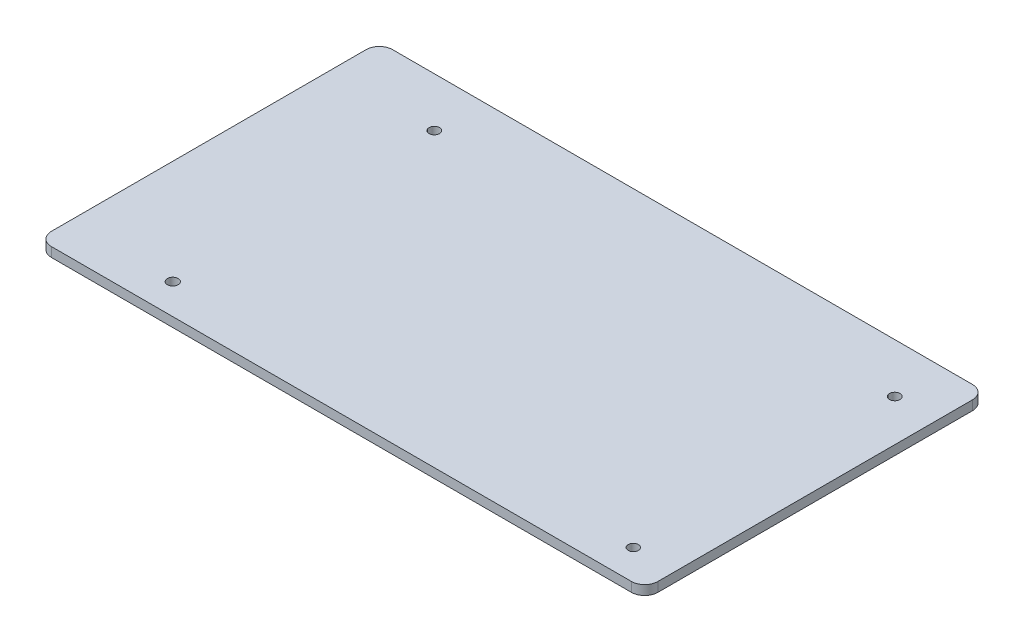
ISO-10303-21;
HEADER;
FILE_DESCRIPTION(('STEP AP214'),'2;1');
FILE_NAME('part.step','',(''),(''),'','','');
FILE_SCHEMA(('AUTOMOTIVE_DESIGN { 1 0 10303 214 1 1 1 1 }'));
ENDSEC;
DATA;
#1=APPLICATION_CONTEXT('core data for automotive mechanical design processes');
#2=APPLICATION_PROTOCOL_DEFINITION('international standard','automotive_design',2000,#1);
#3=PRODUCT_CONTEXT('',#1,'mechanical');
#4=PRODUCT('Part','Part','',(#3));
#5=PRODUCT_RELATED_PRODUCT_CATEGORY('part','',(#4));
#6=PRODUCT_DEFINITION_FORMATION('','',#4);
#7=PRODUCT_DEFINITION_CONTEXT('part definition',#1,'design');
#8=PRODUCT_DEFINITION('design','',#6,#7);
#9=PRODUCT_DEFINITION_SHAPE('','',#8);
#10=(LENGTH_UNIT() NAMED_UNIT(*) SI_UNIT(.MILLI.,.METRE.));
#11=(NAMED_UNIT(*) PLANE_ANGLE_UNIT() SI_UNIT($,.RADIAN.));
#12=(NAMED_UNIT(*) SI_UNIT($,.STERADIAN.) SOLID_ANGLE_UNIT());
#13=UNCERTAINTY_MEASURE_WITH_UNIT(LENGTH_MEASURE(1.E-05),#10,'distance_accuracy_value','');
#14=(GEOMETRIC_REPRESENTATION_CONTEXT(3) GLOBAL_UNCERTAINTY_ASSIGNED_CONTEXT((#13)) GLOBAL_UNIT_ASSIGNED_CONTEXT((#10,
#11,#12)) REPRESENTATION_CONTEXT('',''));
#15=CARTESIAN_POINT('',(0.,0.,0.));
#16=DIRECTION('',(0.,0.,1.));
#17=DIRECTION('',(1.,0.,0.));
#18=AXIS2_PLACEMENT_3D('',#15,#16,#17);
#19=CARTESIAN_POINT('',(-0.000677997091998267,2.5,45.0011504842423));
#20=DIRECTION('',(1.50662168550274E-05,0.,-0.999999999886505));
#21=DIRECTION('',(-0.999999999886505,0.,-1.50662168550274E-05));
#22=AXIS2_PLACEMENT_3D('',#19,#20,#21);
#23=PLANE('',#22);
#24=DIRECTION('',(0.999999999886505,0.,1.50662168550274E-05));
#25=VECTOR('',#24,1.);
#26=CARTESIAN_POINT('',(-0.000677997091998267,0.,45.0011504842423));
#27=LINE('',#26,#25);
#28=CARTESIAN_POINT('',(-76.4988487225898,0.,44.9999989731105));
#29=VERTEX_POINT('',#28);
#30=CARTESIAN_POINT('',(76.5031206921741,0.,45.0023031070637));
#31=VERTEX_POINT('',#30);
#32=EDGE_CURVE('E165',#29,#31,#27,.T.);
#33=ORIENTED_EDGE('',*,*,#32,.T.);
#34=DIRECTION('',(0.,-1.,0.));
#35=VECTOR('',#34,1.);
#36=CARTESIAN_POINT('',(76.5031206921741,2.5,45.0023031070637));
#37=LINE('',#36,#35);
#38=CARTESIAN_POINT('',(76.5031206921741,2.5,45.0023031070637));
#39=VERTEX_POINT('',#38);
#40=EDGE_CURVE('E207',#39,#31,#37,.T.);
#41=ORIENTED_EDGE('',*,*,#40,.F.);
#42=DIRECTION('',(0.999999999886505,0.,1.50662168550274E-05));
#43=VECTOR('',#42,1.);
#44=CARTESIAN_POINT('',(-0.000677997091998267,2.5,45.0011504842423));
#45=LINE('',#44,#43);
#46=CARTESIAN_POINT('',(-76.4988487225898,2.5,44.9999989731105));
#47=VERTEX_POINT('',#46);
#48=EDGE_CURVE('E188',#47,#39,#45,.T.);
#49=ORIENTED_EDGE('',*,*,#48,.F.);
#50=DIRECTION('',(0.,-1.,0.));
#51=VECTOR('',#50,1.);
#52=CARTESIAN_POINT('',(-76.4988487225898,2.5,44.9999989731105));
#53=LINE('',#52,#51);
#54=EDGE_CURVE('E164',#47,#29,#53,.T.);
#55=ORIENTED_EDGE('',*,*,#54,.T.);
#56=EDGE_LOOP('',(#33,#41,#49,#55));
#57=FACE_BOUND('',#56,.T.);
#58=ADVANCED_FACE('F45',(#57),#23,.F.);
#59=CARTESIAN_POINT('',(76.5031206921741,2.5,41.504271968319));
#60=DIRECTION('',(0.,-1.,0.));
#61=DIRECTION('',(0.,0.,-1.));
#62=AXIS2_PLACEMENT_3D('',#59,#60,#61);
#63=CYLINDRICAL_SURFACE('',#62,3.49803113874472);
#64=CARTESIAN_POINT('',(76.5031206921741,0.,41.504271968319));
#65=DIRECTION('',(0.,1.,0.));
#66=DIRECTION('',(0.,0.,1.));
#67=AXIS2_PLACEMENT_3D('',#64,#65,#66);
#68=CIRCLE('',#67,3.49803113874472);
#69=CARTESIAN_POINT('',(80.0011518309188,0.,41.504271968319));
#70=VERTEX_POINT('',#69);
#71=EDGE_CURVE('E169',#31,#70,#68,.T.);
#72=ORIENTED_EDGE('',*,*,#71,.T.);
#73=DIRECTION('',(0.,-1.,0.));
#74=VECTOR('',#73,1.);
#75=CARTESIAN_POINT('',(80.0011518309188,2.5,41.504271968319));
#76=LINE('',#75,#74);
#77=CARTESIAN_POINT('',(80.0011518309188,2.5,41.504271968319));
#78=VERTEX_POINT('',#77);
#79=EDGE_CURVE('E203',#78,#70,#76,.T.);
#80=ORIENTED_EDGE('',*,*,#79,.F.);
#81=CARTESIAN_POINT('',(76.5031206921741,2.5,41.504271968319));
#82=DIRECTION('',(0.,1.,0.));
#83=DIRECTION('',(0.,0.,1.));
#84=AXIS2_PLACEMENT_3D('',#81,#82,#83);
#85=CIRCLE('',#84,3.49803113874472);
#86=EDGE_CURVE('E107',#39,#78,#85,.T.);
#87=ORIENTED_EDGE('',*,*,#86,.F.);
#88=ORIENTED_EDGE('',*,*,#40,.T.);
#89=EDGE_LOOP('',(#72,#80,#87,#88));
#90=FACE_BOUND('',#89,.T.);
#91=ADVANCED_FACE('F240',(#90),#63,.T.);
#92=CARTESIAN_POINT('',(80.0011518309188,2.5,0.));
#93=DIRECTION('',(-1.,0.,0.));
#94=DIRECTION('',(0.,0.,1.));
#95=AXIS2_PLACEMENT_3D('',#92,#93,#94);
#96=PLANE('',#95);
#97=DIRECTION('',(0.,0.,-1.));
#98=VECTOR('',#97,1.);
#99=CARTESIAN_POINT('',(80.0011518309188,0.,0.));
#100=LINE('',#99,#98);
#101=CARTESIAN_POINT('',(80.0011518309188,0.,-41.501969416001));
#102=VERTEX_POINT('',#101);
#103=EDGE_CURVE('E173',#70,#102,#100,.T.);
#104=ORIENTED_EDGE('',*,*,#103,.T.);
#105=DIRECTION('',(0.,-1.,0.));
#106=VECTOR('',#105,1.);
#107=CARTESIAN_POINT('',(80.0011518309188,2.5,-41.501969416001));
#108=LINE('',#107,#106);
#109=CARTESIAN_POINT('',(80.0011518309188,2.5,-41.501969416001));
#110=VERTEX_POINT('',#109);
#111=EDGE_CURVE('E199',#110,#102,#108,.T.);
#112=ORIENTED_EDGE('',*,*,#111,.F.);
#113=DIRECTION('',(0.,0.,-1.));
#114=VECTOR('',#113,1.);
#115=CARTESIAN_POINT('',(80.0011518309188,2.5,0.));
#116=LINE('',#115,#114);
#117=EDGE_CURVE('E342',#78,#110,#116,.T.);
#118=ORIENTED_EDGE('',*,*,#117,.F.);
#119=ORIENTED_EDGE('',*,*,#79,.T.);
#120=EDGE_LOOP('',(#104,#112,#118,#119));
#121=FACE_BOUND('',#120,.T.);
#122=ADVANCED_FACE('F246',(#121),#96,.F.);
#123=CARTESIAN_POINT('',(76.5054232444851,2.5,-41.501969416001));
#124=DIRECTION('',(0.,-1.,0.));
#125=DIRECTION('',(0.,0.,-1.));
#126=AXIS2_PLACEMENT_3D('',#123,#124,#125);
#127=CYLINDRICAL_SURFACE('',#126,3.49572858643372);
#128=CARTESIAN_POINT('',(76.5054232444851,0.,-41.501969416001));
#129=DIRECTION('',(0.,1.,0.));
#130=DIRECTION('',(0.,0.,1.));
#131=AXIS2_PLACEMENT_3D('',#128,#129,#130);
#132=CIRCLE('',#131,3.49572858643372);
#133=CARTESIAN_POINT('',(76.5054232444851,0.,-44.9976980024347));
#134=VERTEX_POINT('',#133);
#135=EDGE_CURVE('E176',#102,#134,#132,.T.);
#136=ORIENTED_EDGE('',*,*,#135,.T.);
#137=DIRECTION('',(0.,-1.,0.));
#138=VECTOR('',#137,1.);
#139=CARTESIAN_POINT('',(76.5054232444851,2.5,-44.9976980024347));
#140=LINE('',#139,#138);
#141=CARTESIAN_POINT('',(76.5054232444851,2.5,-44.9976980024347));
#142=VERTEX_POINT('',#141);
#143=EDGE_CURVE('E195',#142,#134,#140,.T.);
#144=ORIENTED_EDGE('',*,*,#143,.F.);
#145=CARTESIAN_POINT('',(76.5054232444851,2.5,-41.501969416001));
#146=DIRECTION('',(0.,1.,0.));
#147=DIRECTION('',(0.,0.,1.));
#148=AXIS2_PLACEMENT_3D('',#145,#146,#147);
#149=CIRCLE('',#148,3.49572858643372);
#150=EDGE_CURVE('E345',#110,#142,#149,.T.);
#151=ORIENTED_EDGE('',*,*,#150,.F.);
#152=ORIENTED_EDGE('',*,*,#111,.T.);
#153=EDGE_LOOP('',(#136,#144,#151,#152));
#154=FACE_BOUND('',#153,.T.);
#155=ADVANCED_FACE('F251',(#154),#127,.T.);
#156=CARTESIAN_POINT('',(0.000677021881441039,2.5,-44.9988490404797));
#157=DIRECTION('',(-1.50453155091896E-05,0.,0.999999999886819));
#158=DIRECTION('',(0.999999999886819,0.,1.50453155091896E-05));
#159=AXIS2_PLACEMENT_3D('',#156,#157,#158);
#160=PLANE('',#159);
#161=DIRECTION('',(-0.999999999886819,0.,-1.50453155091896E-05));
#162=VECTOR('',#161,1.);
#163=CARTESIAN_POINT('',(0.000677021881441039,0.,-44.9988490404797));
#164=LINE('',#163,#162);
#165=CARTESIAN_POINT('',(-76.3737949172585,0.,-44.999998118507));
#166=VERTEX_POINT('',#165);
#167=EDGE_CURVE('E179',#134,#166,#164,.T.);
#168=ORIENTED_EDGE('',*,*,#167,.T.);
#169=DIRECTION('',(0.,-1.,0.));
#170=VECTOR('',#169,1.);
#171=CARTESIAN_POINT('',(-76.3737949172585,2.5,-44.999998118507));
#172=LINE('',#171,#170);
#173=CARTESIAN_POINT('',(-76.3737949172585,2.5,-44.999998118507));
#174=VERTEX_POINT('',#173);
#175=EDGE_CURVE('E138',#174,#166,#172,.T.);
#176=ORIENTED_EDGE('',*,*,#175,.F.);
#177=DIRECTION('',(-0.999999999886819,0.,-1.50453155091896E-05));
#178=VECTOR('',#177,1.);
#179=CARTESIAN_POINT('',(0.000677021881441039,2.5,-44.9988490404797));
#180=LINE('',#179,#178);
#181=EDGE_CURVE('E127',#142,#174,#180,.T.);
#182=ORIENTED_EDGE('',*,*,#181,.F.);
#183=ORIENTED_EDGE('',*,*,#143,.T.);
#184=EDGE_LOOP('',(#168,#176,#182,#183));
#185=FACE_BOUND('',#184,.T.);
#186=ADVANCED_FACE('F255',(#185),#160,.F.);
#187=CARTESIAN_POINT('',(-76.5008181398539,2.5,-41.504271968311));
#188=DIRECTION('',(0.,-1.,0.));
#189=DIRECTION('',(0.,0.,-1.));
#190=AXIS2_PLACEMENT_3D('',#187,#188,#189);
#191=CYLINDRICAL_SURFACE('',#190,3.49803319255875);
#192=CARTESIAN_POINT('',(-76.5008181398539,0.,-41.504271968311));
#193=DIRECTION('',(0.,1.,0.));
#194=DIRECTION('',(0.,0.,1.));
#195=AXIS2_PLACEMENT_3D('',#192,#193,#194);
#196=CIRCLE('',#195,3.49803319255875);
#197=CARTESIAN_POINT('',(-79.9988487238439,0.,-41.499999999981));
#198=VERTEX_POINT('',#197);
#199=EDGE_CURVE('E136',#166,#198,#196,.T.);
#200=ORIENTED_EDGE('',*,*,#199,.T.);
#201=DIRECTION('',(0.,-1.,0.));
#202=VECTOR('',#201,1.);
#203=CARTESIAN_POINT('',(-79.9988487238439,2.5,-41.499999999981));
#204=LINE('',#203,#202);
#205=CARTESIAN_POINT('',(-79.9988487238439,2.5,-41.499999999981));
#206=VERTEX_POINT('',#205);
#207=EDGE_CURVE('E133',#206,#198,#204,.T.);
#208=ORIENTED_EDGE('',*,*,#207,.F.);
#209=CARTESIAN_POINT('',(-76.5008181398539,2.5,-41.504271968311));
#210=DIRECTION('',(0.,1.,0.));
#211=DIRECTION('',(0.,0.,1.));
#212=AXIS2_PLACEMENT_3D('',#209,#210,#211);
#213=CIRCLE('',#212,3.49803319255875);
#214=EDGE_CURVE('E120',#174,#206,#213,.T.);
#215=ORIENTED_EDGE('',*,*,#214,.F.);
#216=ORIENTED_EDGE('',*,*,#175,.T.);
#217=EDGE_LOOP('',(#200,#208,#215,#216));
#218=FACE_BOUND('',#217,.T.);
#219=ADVANCED_FACE('F134',(#218),#191,.T.);
#220=CARTESIAN_POINT('',(-80.0000012152323,2.5,-0.00222178912824124));
#221=DIRECTION('',(0.999999999614348,0.,2.77723636704316E-05));
#222=DIRECTION('',(2.77723636704316E-05,0.,-0.999999999614348));
#223=AXIS2_PLACEMENT_3D('',#220,#221,#222);
#224=PLANE('',#223);
#225=DIRECTION('',(-2.77723636704316E-05,0.,0.999999999614348));
#226=VECTOR('',#225,1.);
#227=CARTESIAN_POINT('',(-80.0000012152323,0.,-0.00222178912824124));
#228=LINE('',#227,#226);
#229=CARTESIAN_POINT('',(-80.0011538847248,0.,41.501969416019));
#230=VERTEX_POINT('',#229);
#231=EDGE_CURVE('E92',#198,#230,#228,.T.);
#232=ORIENTED_EDGE('',*,*,#231,.T.);
#233=DIRECTION('',(0.,-1.,0.));
#234=VECTOR('',#233,1.);
#235=CARTESIAN_POINT('',(-80.0011538847248,2.5,41.501969416019));
#236=LINE('',#235,#234);
#237=CARTESIAN_POINT('',(-80.0011538847248,2.5,41.501969416019));
#238=VERTEX_POINT('',#237);
#239=EDGE_CURVE('E139',#238,#230,#236,.T.);
#240=ORIENTED_EDGE('',*,*,#239,.F.);
#241=DIRECTION('',(-2.77723636704316E-05,0.,0.999999999614348));
#242=VECTOR('',#241,1.);
#243=CARTESIAN_POINT('',(-80.0000012152323,2.5,-0.00222178912824124));
#244=LINE('',#243,#242);
#245=EDGE_CURVE('E125',#206,#238,#244,.T.);
#246=ORIENTED_EDGE('',*,*,#245,.F.);
#247=ORIENTED_EDGE('',*,*,#207,.T.);
#248=EDGE_LOOP('',(#232,#240,#246,#247));
#249=FACE_BOUND('',#248,.T.);
#250=ADVANCED_FACE('F141',(#249),#224,.F.);
#251=CARTESIAN_POINT('',(69.0011512761561,2.5,37.000000000019));
#252=DIRECTION('',(0.,-1.,0.));
#253=DIRECTION('',(0.,0.,-1.));
#254=AXIS2_PLACEMENT_3D('',#251,#252,#253);
#255=CYLINDRICAL_SURFACE('',#254,1.34367974626423);
#256=CARTESIAN_POINT('',(69.0011512761561,2.5,37.000000000019));
#257=DIRECTION('',(0.,1.,0.));
#258=DIRECTION('',(0.,0.,1.));
#259=AXIS2_PLACEMENT_3D('',#256,#257,#258);
#260=CIRCLE('',#259,1.34367974626423);
#261=CARTESIAN_POINT('',(69.0011512761561,2.5,38.3436797462832));
#262=VERTEX_POINT('',#261);
#263=EDGE_CURVE('E156',#262,#262,#260,.T.);
#264=ORIENTED_EDGE('',*,*,#263,.T.);
#265=EDGE_LOOP('',(#264));
#266=FACE_BOUND('',#265,.T.);
#267=CARTESIAN_POINT('',(69.0011512761561,-3.,37.000000000019));
#268=DIRECTION('',(0.,1.,0.));
#269=DIRECTION('',(0.,0.,1.));
#270=AXIS2_PLACEMENT_3D('',#267,#268,#269);
#271=CIRCLE('',#270,1.34367974626423);
#272=CARTESIAN_POINT('',(69.0011512761561,-3.,38.3436797462832));
#273=VERTEX_POINT('',#272);
#274=EDGE_CURVE('E312',#273,#273,#271,.T.);
#275=ORIENTED_EDGE('',*,*,#274,.F.);
#276=EDGE_LOOP('',(#275));
#277=FACE_BOUND('',#276,.T.);
#278=ADVANCED_FACE('F264',(#266,#277),#255,.F.);
#279=CARTESIAN_POINT('',(-52.4988487238439,2.5,37.000000000019));
#280=DIRECTION('',(0.,-1.,0.));
#281=DIRECTION('',(0.,0.,-1.));
#282=AXIS2_PLACEMENT_3D('',#279,#280,#281);
#283=CYLINDRICAL_SURFACE('',#282,1.42653127066841);
#284=CARTESIAN_POINT('',(-52.4988487238439,2.5,37.000000000019));
#285=DIRECTION('',(0.,1.,0.));
#286=DIRECTION('',(0.,0.,1.));
#287=AXIS2_PLACEMENT_3D('',#284,#285,#286);
#288=CIRCLE('',#287,1.42653127066841);
#289=CARTESIAN_POINT('',(-52.4988487238439,2.5,38.4265312706874));
#290=VERTEX_POINT('',#289);
#291=EDGE_CURVE('E152',#290,#290,#288,.T.);
#292=ORIENTED_EDGE('',*,*,#291,.T.);
#293=EDGE_LOOP('',(#292));
#294=FACE_BOUND('',#293,.T.);
#295=CARTESIAN_POINT('',(-52.4988487238439,-3.,37.000000000019));
#296=DIRECTION('',(0.,1.,0.));
#297=DIRECTION('',(0.,0.,1.));
#298=AXIS2_PLACEMENT_3D('',#295,#296,#297);
#299=CIRCLE('',#298,1.42653127066841);
#300=CARTESIAN_POINT('',(-52.4988487238439,-3.,38.4265312706874));
#301=VERTEX_POINT('',#300);
#302=EDGE_CURVE('E307',#301,#301,#299,.T.);
#303=ORIENTED_EDGE('',*,*,#302,.F.);
#304=EDGE_LOOP('',(#303));
#305=FACE_BOUND('',#304,.T.);
#306=ADVANCED_FACE('F272',(#294,#305),#283,.F.);
#307=CARTESIAN_POINT('',(-52.4988487238439,2.5,-31.999999999981));
#308=DIRECTION('',(0.,-1.,0.));
#309=DIRECTION('',(0.,0.,-1.));
#310=AXIS2_PLACEMENT_3D('',#307,#308,#309);
#311=CYLINDRICAL_SURFACE('',#310,1.37828522762866);
#312=CARTESIAN_POINT('',(-52.4988487238439,2.5,-31.999999999981));
#313=DIRECTION('',(0.,1.,0.));
#314=DIRECTION('',(0.,0.,1.));
#315=AXIS2_PLACEMENT_3D('',#312,#313,#314);
#316=CIRCLE('',#315,1.37828522762866);
#317=CARTESIAN_POINT('',(-52.4988487238439,2.5,-30.6217147723523));
#318=VERTEX_POINT('',#317);
#319=EDGE_CURVE('E145',#318,#318,#316,.T.);
#320=ORIENTED_EDGE('',*,*,#319,.T.);
#321=EDGE_LOOP('',(#320));
#322=FACE_BOUND('',#321,.T.);
#323=CARTESIAN_POINT('',(-52.4988487238439,-3.,-31.999999999981));
#324=DIRECTION('',(0.,1.,0.));
#325=DIRECTION('',(0.,0.,1.));
#326=AXIS2_PLACEMENT_3D('',#323,#324,#325);
#327=CIRCLE('',#326,1.37828522762866);
#328=CARTESIAN_POINT('',(-52.4988487238439,-3.,-30.6217147723523));
#329=VERTEX_POINT('',#328);
#330=EDGE_CURVE('E332',#329,#329,#327,.T.);
#331=ORIENTED_EDGE('',*,*,#330,.F.);
#332=EDGE_LOOP('',(#331));
#333=FACE_BOUND('',#332,.T.);
#334=ADVANCED_FACE('F269',(#322,#333),#311,.F.);
#335=CARTESIAN_POINT('',(-76.5031206921639,2.5,41.501969416019));
#336=DIRECTION('',(0.,-1.,0.));
#337=DIRECTION('',(0.,0.,-1.));
#338=AXIS2_PLACEMENT_3D('',#335,#336,#337);
#339=CYLINDRICAL_SURFACE('',#338,3.49803319256087);
#340=CARTESIAN_POINT('',(-76.5031206921639,0.,41.501969416019));
#341=DIRECTION('',(0.,1.,0.));
#342=DIRECTION('',(0.,0.,1.));
#343=AXIS2_PLACEMENT_3D('',#340,#341,#342);
#344=CIRCLE('',#343,3.49803319256087);
#345=EDGE_CURVE('E98',#230,#29,#344,.T.);
#346=ORIENTED_EDGE('',*,*,#345,.T.);
#347=ORIENTED_EDGE('',*,*,#54,.F.);
#348=CARTESIAN_POINT('',(-76.5031206921639,2.5,41.501969416019));
#349=DIRECTION('',(0.,1.,0.));
#350=DIRECTION('',(0.,0.,1.));
#351=AXIS2_PLACEMENT_3D('',#348,#349,#350);
#352=CIRCLE('',#351,3.49803319256087);
#353=EDGE_CURVE('E63',#238,#47,#352,.T.);
#354=ORIENTED_EDGE('',*,*,#353,.F.);
#355=ORIENTED_EDGE('',*,*,#239,.T.);
#356=EDGE_LOOP('',(#346,#347,#354,#355));
#357=FACE_BOUND('',#356,.T.);
#358=ADVANCED_FACE('F265',(#357),#339,.T.);
#359=CARTESIAN_POINT('',(69.0011512761561,2.5,-31.999999999981));
#360=DIRECTION('',(0.,-1.,0.));
#361=DIRECTION('',(0.,0.,-1.));
#362=AXIS2_PLACEMENT_3D('',#359,#360,#361);
#363=CYLINDRICAL_SURFACE('',#362,1.3858561347082);
#364=CARTESIAN_POINT('',(69.0011512761561,2.5,-31.999999999981));
#365=DIRECTION('',(0.,1.,0.));
#366=DIRECTION('',(0.,0.,1.));
#367=AXIS2_PLACEMENT_3D('',#364,#365,#366);
#368=CIRCLE('',#367,1.3858561347082);
#369=CARTESIAN_POINT('',(69.0011512761561,2.5,-30.6141438652728));
#370=VERTEX_POINT('',#369);
#371=EDGE_CURVE('E160',#370,#370,#368,.T.);
#372=ORIENTED_EDGE('',*,*,#371,.T.);
#373=EDGE_LOOP('',(#372));
#374=FACE_BOUND('',#373,.T.);
#375=CARTESIAN_POINT('',(69.0011512761561,-3.,-31.999999999981));
#376=DIRECTION('',(0.,1.,0.));
#377=DIRECTION('',(0.,0.,1.));
#378=AXIS2_PLACEMENT_3D('',#375,#376,#377);
#379=CIRCLE('',#378,1.3858561347082);
#380=CARTESIAN_POINT('',(69.0011512761561,-3.,-30.6141438652728));
#381=VERTEX_POINT('',#380);
#382=EDGE_CURVE('E324',#381,#381,#379,.T.);
#383=ORIENTED_EDGE('',*,*,#382,.F.);
#384=EDGE_LOOP('',(#383));
#385=FACE_BOUND('',#384,.T.);
#386=ADVANCED_FACE('F268',(#374,#385),#363,.F.);
#387=CARTESIAN_POINT('',(0.,2.5,0.));
#388=DIRECTION('',(0.,1.,0.));
#389=DIRECTION('',(0.,0.,1.));
#390=AXIS2_PLACEMENT_3D('',#387,#388,#389);
#391=PLANE('',#390);
#392=ORIENTED_EDGE('',*,*,#48,.T.);
#393=ORIENTED_EDGE('',*,*,#86,.T.);
#394=ORIENTED_EDGE('',*,*,#117,.T.);
#395=ORIENTED_EDGE('',*,*,#150,.T.);
#396=ORIENTED_EDGE('',*,*,#181,.T.);
#397=ORIENTED_EDGE('',*,*,#214,.T.);
#398=ORIENTED_EDGE('',*,*,#245,.T.);
#399=ORIENTED_EDGE('',*,*,#353,.T.);
#400=EDGE_LOOP('',(#392,#393,#394,#395,#396,#397,#398,#399));
#401=FACE_BOUND('',#400,.T.);
#402=ORIENTED_EDGE('',*,*,#319,.F.);
#403=EDGE_LOOP('',(#402));
#404=FACE_BOUND('',#403,.T.);
#405=ORIENTED_EDGE('',*,*,#291,.F.);
#406=EDGE_LOOP('',(#405));
#407=FACE_BOUND('',#406,.T.);
#408=ORIENTED_EDGE('',*,*,#263,.F.);
#409=EDGE_LOOP('',(#408));
#410=FACE_BOUND('',#409,.T.);
#411=ORIENTED_EDGE('',*,*,#371,.F.);
#412=EDGE_LOOP('',(#411));
#413=FACE_BOUND('',#412,.T.);
#414=ADVANCED_FACE('F122',(#401,#404,#407,#410,#413),#391,.T.);
#415=CARTESIAN_POINT('',(0.,0.,0.));
#416=DIRECTION('',(0.,1.,0.));
#417=DIRECTION('',(0.,0.,1.));
#418=AXIS2_PLACEMENT_3D('',#415,#416,#417);
#419=PLANE('',#418);
#420=CARTESIAN_POINT('',(-52.4988487238439,0.,37.000000000019));
#421=DIRECTION('',(0.,1.,0.));
#422=DIRECTION('',(0.,0.,1.));
#423=AXIS2_PLACEMENT_3D('',#420,#421,#422);
#424=CIRCLE('',#423,6.);
#425=CARTESIAN_POINT('',(-52.4988487238439,0.,43.000000000019));
#426=VERTEX_POINT('',#425);
#427=EDGE_CURVE('E11',#426,#426,#424,.T.);
#428=ORIENTED_EDGE('',*,*,#427,.T.);
#429=EDGE_LOOP('',(#428));
#430=FACE_BOUND('',#429,.T.);
#431=CARTESIAN_POINT('',(-52.4988487238439,0.,-31.999999999981));
#432=DIRECTION('',(0.,1.,0.));
#433=DIRECTION('',(0.,0.,1.));
#434=AXIS2_PLACEMENT_3D('',#431,#432,#433);
#435=CIRCLE('',#434,6.);
#436=CARTESIAN_POINT('',(-52.4988487238439,0.,-25.999999999981));
#437=VERTEX_POINT('',#436);
#438=EDGE_CURVE('E55',#437,#437,#435,.T.);
#439=ORIENTED_EDGE('',*,*,#438,.T.);
#440=EDGE_LOOP('',(#439));
#441=FACE_BOUND('',#440,.T.);
#442=CARTESIAN_POINT('',(69.0011512761561,0.,-31.999999999981));
#443=DIRECTION('',(0.,1.,0.));
#444=DIRECTION('',(0.,0.,1.));
#445=AXIS2_PLACEMENT_3D('',#442,#443,#444);
#446=CIRCLE('',#445,6.00000000000001);
#447=CARTESIAN_POINT('',(69.0011512761561,0.,-25.999999999981));
#448=VERTEX_POINT('',#447);
#449=EDGE_CURVE('E214',#448,#448,#446,.T.);
#450=ORIENTED_EDGE('',*,*,#449,.T.);
#451=EDGE_LOOP('',(#450));
#452=FACE_BOUND('',#451,.T.);
#453=CARTESIAN_POINT('',(69.0011512761561,0.,37.000000000019));
#454=DIRECTION('',(0.,1.,0.));
#455=DIRECTION('',(0.,0.,1.));
#456=AXIS2_PLACEMENT_3D('',#453,#454,#455);
#457=CIRCLE('',#456,6.00000000000001);
#458=CARTESIAN_POINT('',(69.0011512761561,0.,43.000000000019));
#459=VERTEX_POINT('',#458);
#460=EDGE_CURVE('E210',#459,#459,#457,.T.);
#461=ORIENTED_EDGE('',*,*,#460,.T.);
#462=EDGE_LOOP('',(#461));
#463=FACE_BOUND('',#462,.T.);
#464=ORIENTED_EDGE('',*,*,#32,.F.);
#465=ORIENTED_EDGE('',*,*,#345,.F.);
#466=ORIENTED_EDGE('',*,*,#231,.F.);
#467=ORIENTED_EDGE('',*,*,#199,.F.);
#468=ORIENTED_EDGE('',*,*,#167,.F.);
#469=ORIENTED_EDGE('',*,*,#135,.F.);
#470=ORIENTED_EDGE('',*,*,#103,.F.);
#471=ORIENTED_EDGE('',*,*,#71,.F.);
#472=EDGE_LOOP('',(#464,#465,#466,#467,#468,#469,#470,#471));
#473=FACE_BOUND('',#472,.T.);
#474=ADVANCED_FACE('F221',(#430,#441,#452,#463,#473),#419,.F.);
#475=CARTESIAN_POINT('',(0.,-3.,0.));
#476=DIRECTION('',(0.,1.,0.));
#477=DIRECTION('',(0.,0.,1.));
#478=AXIS2_PLACEMENT_3D('',#475,#476,#477);
#479=PLANE('',#478);
#480=ORIENTED_EDGE('',*,*,#330,.T.);
#481=EDGE_LOOP('',(#480));
#482=FACE_BOUND('',#481,.T.);
#483=CARTESIAN_POINT('',(-52.4988487238439,-3.,-31.999999999981));
#484=DIRECTION('',(0.,1.,0.));
#485=DIRECTION('',(0.,0.,1.));
#486=AXIS2_PLACEMENT_3D('',#483,#484,#485);
#487=CIRCLE('',#486,3.);
#488=CARTESIAN_POINT('',(-52.4988487238439,-3.,-28.999999999981));
#489=VERTEX_POINT('',#488);
#490=EDGE_CURVE('E170',#489,#489,#487,.T.);
#491=ORIENTED_EDGE('',*,*,#490,.F.);
#492=EDGE_LOOP('',(#491));
#493=FACE_BOUND('',#492,.T.);
#494=ADVANCED_FACE('F285',(#482,#493),#479,.F.);
#495=CARTESIAN_POINT('',(0.,-3.,0.));
#496=DIRECTION('',(0.,1.,0.));
#497=DIRECTION('',(0.,0.,1.));
#498=AXIS2_PLACEMENT_3D('',#495,#496,#497);
#499=PLANE('',#498);
#500=ORIENTED_EDGE('',*,*,#382,.T.);
#501=EDGE_LOOP('',(#500));
#502=FACE_BOUND('',#501,.T.);
#503=CARTESIAN_POINT('',(69.0011512761561,-3.,-31.999999999981));
#504=DIRECTION('',(0.,1.,0.));
#505=DIRECTION('',(0.,0.,1.));
#506=AXIS2_PLACEMENT_3D('',#503,#504,#505);
#507=CIRCLE('',#506,3.00000000000001);
#508=CARTESIAN_POINT('',(69.0011512761561,-3.,-28.999999999981));
#509=VERTEX_POINT('',#508);
#510=EDGE_CURVE('E328',#509,#509,#507,.T.);
#511=ORIENTED_EDGE('',*,*,#510,.F.);
#512=EDGE_LOOP('',(#511));
#513=FACE_BOUND('',#512,.T.);
#514=ADVANCED_FACE('F291',(#502,#513),#499,.F.);
#515=CARTESIAN_POINT('',(0.,-3.,0.));
#516=DIRECTION('',(0.,1.,0.));
#517=DIRECTION('',(0.,0.,1.));
#518=AXIS2_PLACEMENT_3D('',#515,#516,#517);
#519=PLANE('',#518);
#520=ORIENTED_EDGE('',*,*,#274,.T.);
#521=EDGE_LOOP('',(#520));
#522=FACE_BOUND('',#521,.T.);
#523=CARTESIAN_POINT('',(69.0011512761561,-3.,37.000000000019));
#524=DIRECTION('',(0.,1.,0.));
#525=DIRECTION('',(0.,0.,1.));
#526=AXIS2_PLACEMENT_3D('',#523,#524,#525);
#527=CIRCLE('',#526,3.00000000000001);
#528=CARTESIAN_POINT('',(69.0011512761561,-3.,40.000000000019));
#529=VERTEX_POINT('',#528);
#530=EDGE_CURVE('E317',#529,#529,#527,.T.);
#531=ORIENTED_EDGE('',*,*,#530,.F.);
#532=EDGE_LOOP('',(#531));
#533=FACE_BOUND('',#532,.T.);
#534=ADVANCED_FACE('F295',(#522,#533),#519,.F.);
#535=CARTESIAN_POINT('',(0.,-3.,0.));
#536=DIRECTION('',(0.,1.,0.));
#537=DIRECTION('',(0.,0.,1.));
#538=AXIS2_PLACEMENT_3D('',#535,#536,#537);
#539=PLANE('',#538);
#540=ORIENTED_EDGE('',*,*,#302,.T.);
#541=EDGE_LOOP('',(#540));
#542=FACE_BOUND('',#541,.T.);
#543=CARTESIAN_POINT('',(-52.4988487238439,-3.,37.000000000019));
#544=DIRECTION('',(0.,1.,0.));
#545=DIRECTION('',(0.,0.,1.));
#546=AXIS2_PLACEMENT_3D('',#543,#544,#545);
#547=CIRCLE('',#546,3.);
#548=CARTESIAN_POINT('',(-52.4988487238439,-3.,40.000000000019));
#549=VERTEX_POINT('',#548);
#550=EDGE_CURVE('E310',#549,#549,#547,.T.);
#551=ORIENTED_EDGE('',*,*,#550,.F.);
#552=EDGE_LOOP('',(#551));
#553=FACE_BOUND('',#552,.T.);
#554=ADVANCED_FACE('F235',(#542,#553),#539,.F.);
#555=CARTESIAN_POINT('',(-52.4988487238439,-3.,37.000000000019));
#556=DIRECTION('',(0.,1.,0.));
#557=DIRECTION('',(0.,0.,1.));
#558=AXIS2_PLACEMENT_3D('',#555,#556,#557);
#559=TOROIDAL_SURFACE('',#558,6.,3.);
#560=ORIENTED_EDGE('',*,*,#550,.T.);
#561=EDGE_LOOP('',(#560));
#562=FACE_BOUND('',#561,.T.);
#563=ORIENTED_EDGE('',*,*,#427,.F.);
#564=EDGE_LOOP('',(#563));
#565=FACE_BOUND('',#564,.T.);
#566=ADVANCED_FACE('F227',(#562,#565),#559,.F.);
#567=CARTESIAN_POINT('',(-52.4988487238439,-3.,-31.999999999981));
#568=DIRECTION('',(0.,1.,0.));
#569=DIRECTION('',(0.,0.,1.));
#570=AXIS2_PLACEMENT_3D('',#567,#568,#569);
#571=TOROIDAL_SURFACE('',#570,6.,3.);
#572=ORIENTED_EDGE('',*,*,#490,.T.);
#573=EDGE_LOOP('',(#572));
#574=FACE_BOUND('',#573,.T.);
#575=ORIENTED_EDGE('',*,*,#438,.F.);
#576=EDGE_LOOP('',(#575));
#577=FACE_BOUND('',#576,.T.);
#578=ADVANCED_FACE('F224',(#574,#577),#571,.F.);
#579=CARTESIAN_POINT('',(69.0011512761561,-3.,-31.999999999981));
#580=DIRECTION('',(0.,1.,0.));
#581=DIRECTION('',(0.,0.,1.));
#582=AXIS2_PLACEMENT_3D('',#579,#580,#581);
#583=TOROIDAL_SURFACE('',#582,6.00000000000001,3.);
#584=ORIENTED_EDGE('',*,*,#510,.T.);
#585=EDGE_LOOP('',(#584));
#586=FACE_BOUND('',#585,.T.);
#587=ORIENTED_EDGE('',*,*,#449,.F.);
#588=EDGE_LOOP('',(#587));
#589=FACE_BOUND('',#588,.T.);
#590=ADVANCED_FACE('F226',(#586,#589),#583,.F.);
#591=CARTESIAN_POINT('',(69.0011512761561,-3.,37.000000000019));
#592=DIRECTION('',(0.,1.,0.));
#593=DIRECTION('',(0.,0.,1.));
#594=AXIS2_PLACEMENT_3D('',#591,#592,#593);
#595=TOROIDAL_SURFACE('',#594,6.00000000000001,3.);
#596=ORIENTED_EDGE('',*,*,#530,.T.);
#597=EDGE_LOOP('',(#596));
#598=FACE_BOUND('',#597,.T.);
#599=ORIENTED_EDGE('',*,*,#460,.F.);
#600=EDGE_LOOP('',(#599));
#601=FACE_BOUND('',#600,.T.);
#602=ADVANCED_FACE('F47',(#598,#601),#595,.F.);
#603=CLOSED_SHELL('',(#58,#91,#122,#155,#186,#219,#250,#278,#306,#334,#358,#386,#414,#474,#494,
#514,#534,#554,#566,#578,#590,#602));
#604=MANIFOLD_SOLID_BREP('B2',#603);
#605=ADVANCED_BREP_SHAPE_REPRESENTATION('',(#18,#604),#14);
#606=SHAPE_DEFINITION_REPRESENTATION(#9,#605);
ENDSEC;
END-ISO-10303-21;
